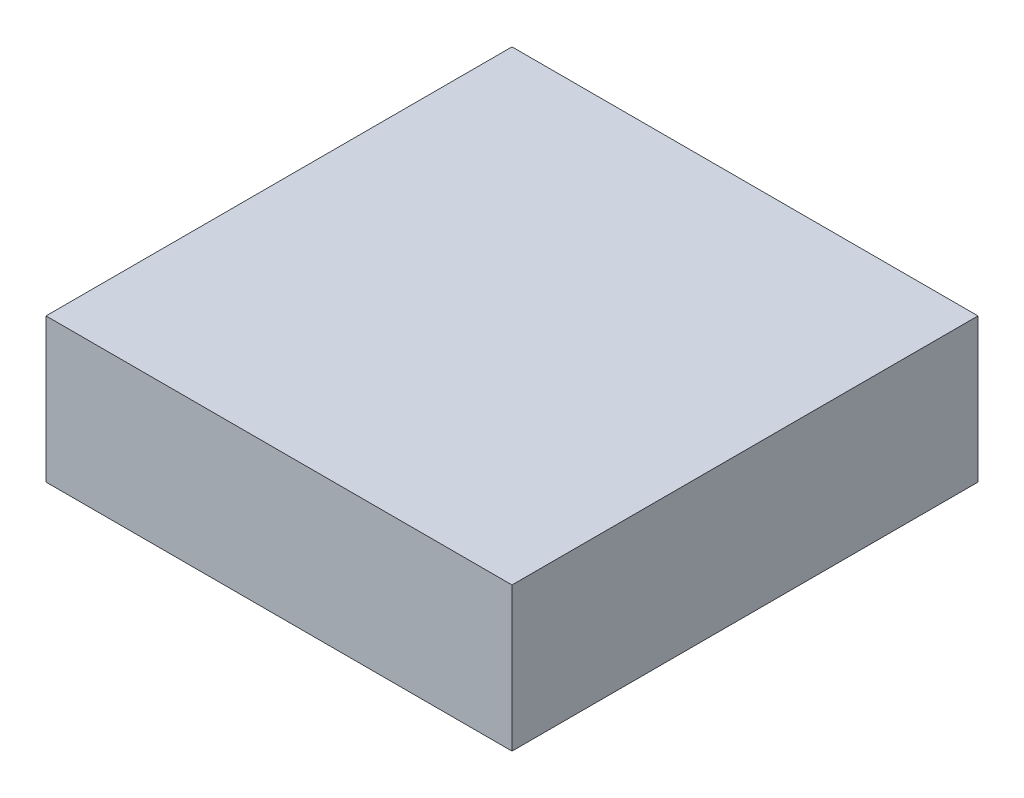
ISO-10303-21;
HEADER;
FILE_DESCRIPTION(('STEP AP214'),'2;1');
FILE_NAME('part.step','',(''),(''),'','','');
FILE_SCHEMA(('AUTOMOTIVE_DESIGN { 1 0 10303 214 1 1 1 1 }'));
ENDSEC;
DATA;
#1=APPLICATION_CONTEXT('core data for automotive mechanical design processes');
#2=APPLICATION_PROTOCOL_DEFINITION('international standard','automotive_design',2000,#1);
#3=PRODUCT_CONTEXT('',#1,'mechanical');
#4=PRODUCT('Part','Part','',(#3));
#5=PRODUCT_RELATED_PRODUCT_CATEGORY('part','',(#4));
#6=PRODUCT_DEFINITION_FORMATION('','',#4);
#7=PRODUCT_DEFINITION_CONTEXT('part definition',#1,'design');
#8=PRODUCT_DEFINITION('design','',#6,#7);
#9=PRODUCT_DEFINITION_SHAPE('','',#8);
#10=(LENGTH_UNIT() NAMED_UNIT(*) SI_UNIT(.MILLI.,.METRE.));
#11=(NAMED_UNIT(*) PLANE_ANGLE_UNIT() SI_UNIT($,.RADIAN.));
#12=(NAMED_UNIT(*) SI_UNIT($,.STERADIAN.) SOLID_ANGLE_UNIT());
#13=UNCERTAINTY_MEASURE_WITH_UNIT(LENGTH_MEASURE(1.E-05),#10,'distance_accuracy_value','');
#14=(GEOMETRIC_REPRESENTATION_CONTEXT(3) GLOBAL_UNCERTAINTY_ASSIGNED_CONTEXT((#13)) GLOBAL_UNIT_ASSIGNED_CONTEXT((#10,
#11,#12)) REPRESENTATION_CONTEXT('',''));
#15=CARTESIAN_POINT('',(0.,0.,0.));
#16=DIRECTION('',(0.,0.,1.));
#17=DIRECTION('',(1.,0.,0.));
#18=AXIS2_PLACEMENT_3D('',#15,#16,#17);
#19=CARTESIAN_POINT('',(-5.715,3.5306,5.715));
#20=DIRECTION('',(1.,0.,0.));
#21=DIRECTION('',(0.,0.,-1.));
#22=AXIS2_PLACEMENT_3D('',#19,#20,#21);
#23=PLANE('',#22);
#24=DIRECTION('',(0.,0.,1.));
#25=VECTOR('',#24,1.);
#26=CARTESIAN_POINT('',(-5.715,0.,5.715));
#27=LINE('',#26,#25);
#28=CARTESIAN_POINT('',(-5.715,0.,-5.715));
#29=VERTEX_POINT('',#28);
#30=CARTESIAN_POINT('',(-5.715,0.,5.715));
#31=VERTEX_POINT('',#30);
#32=EDGE_CURVE('E95',#29,#31,#27,.T.);
#33=ORIENTED_EDGE('',*,*,#32,.T.);
#34=DIRECTION('',(0.,-1.,0.));
#35=VECTOR('',#34,1.);
#36=CARTESIAN_POINT('',(-5.715,3.5306,5.715));
#37=LINE('',#36,#35);
#38=CARTESIAN_POINT('',(-5.715,3.5306,5.715));
#39=VERTEX_POINT('',#38);
#40=EDGE_CURVE('E11',#39,#31,#37,.T.);
#41=ORIENTED_EDGE('',*,*,#40,.F.);
#42=DIRECTION('',(0.,0.,1.));
#43=VECTOR('',#42,1.);
#44=CARTESIAN_POINT('',(-5.715,3.5306,5.715));
#45=LINE('',#44,#43);
#46=CARTESIAN_POINT('',(-5.715,3.5306,-5.715));
#47=VERTEX_POINT('',#46);
#48=EDGE_CURVE('E83',#47,#39,#45,.T.);
#49=ORIENTED_EDGE('',*,*,#48,.F.);
#50=DIRECTION('',(0.,-1.,0.));
#51=VECTOR('',#50,1.);
#52=CARTESIAN_POINT('',(-5.715,3.5306,-5.715));
#53=LINE('',#52,#51);
#54=EDGE_CURVE('E91',#47,#29,#53,.T.);
#55=ORIENTED_EDGE('',*,*,#54,.T.);
#56=EDGE_LOOP('',(#33,#41,#49,#55));
#57=FACE_BOUND('',#56,.T.);
#58=ADVANCED_FACE('F32',(#57),#23,.F.);
#59=CARTESIAN_POINT('',(5.715,3.5306,5.715));
#60=DIRECTION('',(0.,0.,-1.));
#61=DIRECTION('',(-1.,0.,0.));
#62=AXIS2_PLACEMENT_3D('',#59,#60,#61);
#63=PLANE('',#62);
#64=DIRECTION('',(1.,0.,0.));
#65=VECTOR('',#64,1.);
#66=CARTESIAN_POINT('',(5.715,0.,5.715));
#67=LINE('',#66,#65);
#68=CARTESIAN_POINT('',(5.715,0.,5.715));
#69=VERTEX_POINT('',#68);
#70=EDGE_CURVE('E87',#31,#69,#67,.T.);
#71=ORIENTED_EDGE('',*,*,#70,.T.);
#72=DIRECTION('',(0.,-1.,0.));
#73=VECTOR('',#72,1.);
#74=CARTESIAN_POINT('',(5.715,3.5306,5.715));
#75=LINE('',#74,#73);
#76=CARTESIAN_POINT('',(5.715,3.5306,5.715));
#77=VERTEX_POINT('',#76);
#78=EDGE_CURVE('E40',#77,#69,#75,.T.);
#79=ORIENTED_EDGE('',*,*,#78,.F.);
#80=DIRECTION('',(1.,0.,0.));
#81=VECTOR('',#80,1.);
#82=CARTESIAN_POINT('',(5.715,3.5306,5.715));
#83=LINE('',#82,#81);
#84=EDGE_CURVE('E78',#39,#77,#83,.T.);
#85=ORIENTED_EDGE('',*,*,#84,.F.);
#86=ORIENTED_EDGE('',*,*,#40,.T.);
#87=EDGE_LOOP('',(#71,#79,#85,#86));
#88=FACE_BOUND('',#87,.T.);
#89=ADVANCED_FACE('F86',(#88),#63,.F.);
#90=CARTESIAN_POINT('',(5.715,3.5306,5.715));
#91=DIRECTION('',(-1.,0.,0.));
#92=DIRECTION('',(0.,0.,1.));
#93=AXIS2_PLACEMENT_3D('',#90,#91,#92);
#94=PLANE('',#93);
#95=DIRECTION('',(0.,0.,-1.));
#96=VECTOR('',#95,1.);
#97=CARTESIAN_POINT('',(5.715,0.,5.715));
#98=LINE('',#97,#96);
#99=CARTESIAN_POINT('',(5.715,0.,-5.715));
#100=VERTEX_POINT('',#99);
#101=EDGE_CURVE('E65',#69,#100,#98,.T.);
#102=ORIENTED_EDGE('',*,*,#101,.T.);
#103=DIRECTION('',(0.,-1.,0.));
#104=VECTOR('',#103,1.);
#105=CARTESIAN_POINT('',(5.715,3.5306,-5.715));
#106=LINE('',#105,#104);
#107=CARTESIAN_POINT('',(5.715,3.5306,-5.715));
#108=VERTEX_POINT('',#107);
#109=EDGE_CURVE('E88',#108,#100,#106,.T.);
#110=ORIENTED_EDGE('',*,*,#109,.F.);
#111=DIRECTION('',(0.,0.,-1.));
#112=VECTOR('',#111,1.);
#113=CARTESIAN_POINT('',(5.715,3.5306,5.715));
#114=LINE('',#113,#112);
#115=EDGE_CURVE('E81',#77,#108,#114,.T.);
#116=ORIENTED_EDGE('',*,*,#115,.F.);
#117=ORIENTED_EDGE('',*,*,#78,.T.);
#118=EDGE_LOOP('',(#102,#110,#116,#117));
#119=FACE_BOUND('',#118,.T.);
#120=ADVANCED_FACE('F89',(#119),#94,.F.);
#121=CARTESIAN_POINT('',(5.715,3.5306,-5.715));
#122=DIRECTION('',(0.,0.,1.));
#123=DIRECTION('',(1.,0.,0.));
#124=AXIS2_PLACEMENT_3D('',#121,#122,#123);
#125=PLANE('',#124);
#126=DIRECTION('',(-1.,0.,0.));
#127=VECTOR('',#126,1.);
#128=CARTESIAN_POINT('',(5.715,0.,-5.715));
#129=LINE('',#128,#127);
#130=EDGE_CURVE('E71',#100,#29,#129,.T.);
#131=ORIENTED_EDGE('',*,*,#130,.T.);
#132=ORIENTED_EDGE('',*,*,#54,.F.);
#133=DIRECTION('',(-1.,0.,0.));
#134=VECTOR('',#133,1.);
#135=CARTESIAN_POINT('',(5.715,3.5306,-5.715));
#136=LINE('',#135,#134);
#137=EDGE_CURVE('E48',#108,#47,#136,.T.);
#138=ORIENTED_EDGE('',*,*,#137,.F.);
#139=ORIENTED_EDGE('',*,*,#109,.T.);
#140=EDGE_LOOP('',(#131,#132,#138,#139));
#141=FACE_BOUND('',#140,.T.);
#142=ADVANCED_FACE('F102',(#141),#125,.F.);
#143=CARTESIAN_POINT('',(-5.715,3.5306,-5.715));
#144=DIRECTION('',(0.,1.,0.));
#145=DIRECTION('',(0.,0.,1.));
#146=AXIS2_PLACEMENT_3D('',#143,#144,#145);
#147=PLANE('',#146);
#148=ORIENTED_EDGE('',*,*,#48,.T.);
#149=ORIENTED_EDGE('',*,*,#84,.T.);
#150=ORIENTED_EDGE('',*,*,#115,.T.);
#151=ORIENTED_EDGE('',*,*,#137,.T.);
#152=EDGE_LOOP('',(#148,#149,#150,#151));
#153=FACE_BOUND('',#152,.T.);
#154=ADVANCED_FACE('F79',(#153),#147,.T.);
#155=CARTESIAN_POINT('',(-5.715,0.,-5.715));
#156=DIRECTION('',(0.,1.,0.));
#157=DIRECTION('',(0.,0.,1.));
#158=AXIS2_PLACEMENT_3D('',#155,#156,#157);
#159=PLANE('',#158);
#160=ORIENTED_EDGE('',*,*,#32,.F.);
#161=ORIENTED_EDGE('',*,*,#130,.F.);
#162=ORIENTED_EDGE('',*,*,#101,.F.);
#163=ORIENTED_EDGE('',*,*,#70,.F.);
#164=EDGE_LOOP('',(#160,#161,#162,#163));
#165=FACE_BOUND('',#164,.T.);
#166=ADVANCED_FACE('F105',(#165),#159,.F.);
#167=CLOSED_SHELL('',(#58,#89,#120,#142,#154,#166));
#168=MANIFOLD_SOLID_BREP('B2',#167);
#169=ADVANCED_BREP_SHAPE_REPRESENTATION('',(#18,#168),#14);
#170=SHAPE_DEFINITION_REPRESENTATION(#9,#169);
ENDSEC;
END-ISO-10303-21;
